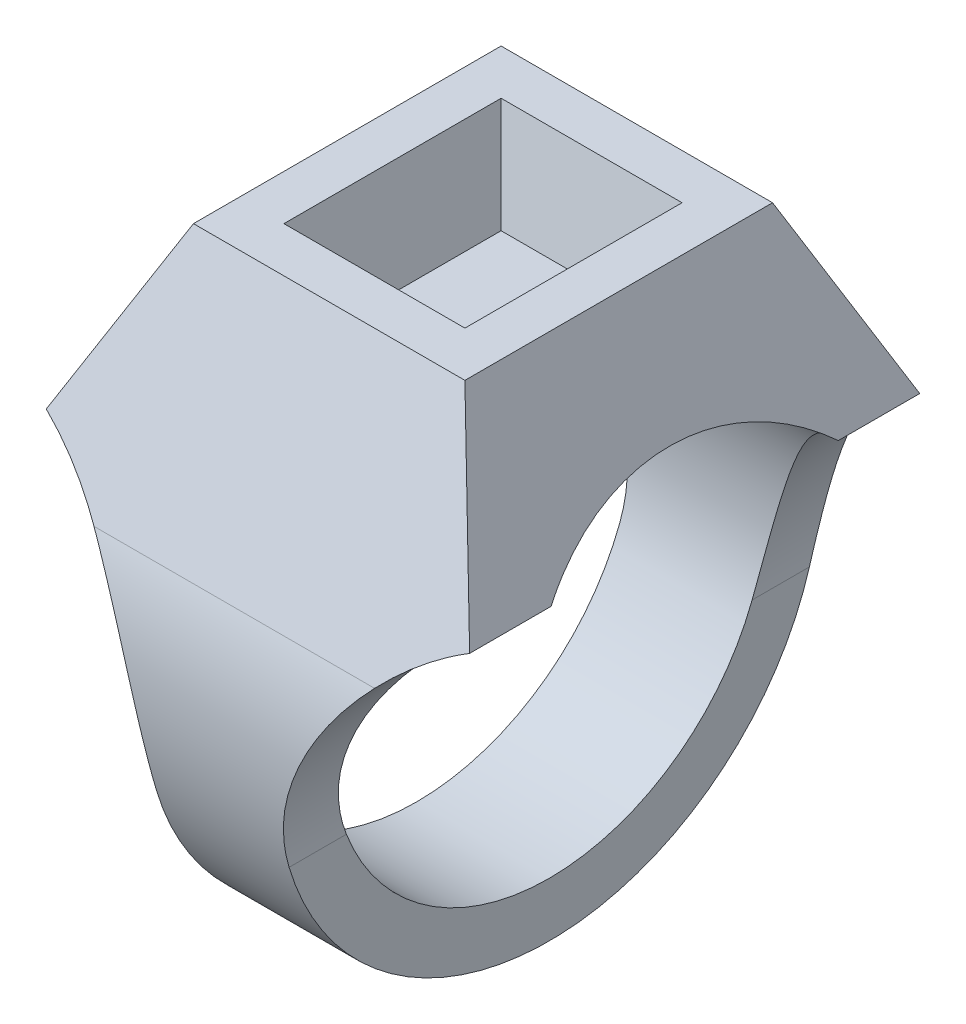
ISO-10303-21;
HEADER;
FILE_DESCRIPTION(('STEP AP214'),'2;1');
FILE_NAME('part.step','',(''),(''),'','','');
FILE_SCHEMA(('AUTOMOTIVE_DESIGN { 1 0 10303 214 1 1 1 1 }'));
ENDSEC;
DATA;
#1=APPLICATION_CONTEXT('core data for automotive mechanical design processes');
#2=APPLICATION_PROTOCOL_DEFINITION('international standard','automotive_design',2000,#1);
#3=PRODUCT_CONTEXT('',#1,'mechanical');
#4=PRODUCT('Part','Part','',(#3));
#5=PRODUCT_RELATED_PRODUCT_CATEGORY('part','',(#4));
#6=PRODUCT_DEFINITION_FORMATION('','',#4);
#7=PRODUCT_DEFINITION_CONTEXT('part definition',#1,'design');
#8=PRODUCT_DEFINITION('design','',#6,#7);
#9=PRODUCT_DEFINITION_SHAPE('','',#8);
#10=(LENGTH_UNIT() NAMED_UNIT(*) SI_UNIT(.MILLI.,.METRE.));
#11=(NAMED_UNIT(*) PLANE_ANGLE_UNIT() SI_UNIT($,.RADIAN.));
#12=(NAMED_UNIT(*) SI_UNIT($,.STERADIAN.) SOLID_ANGLE_UNIT());
#13=UNCERTAINTY_MEASURE_WITH_UNIT(LENGTH_MEASURE(1.E-05),#10,'distance_accuracy_value','');
#14=(GEOMETRIC_REPRESENTATION_CONTEXT(3) GLOBAL_UNCERTAINTY_ASSIGNED_CONTEXT((#13)) GLOBAL_UNIT_ASSIGNED_CONTEXT((#10,
#11,#12)) REPRESENTATION_CONTEXT('',''));
#15=CARTESIAN_POINT('',(0.,0.,0.));
#16=DIRECTION('',(0.,0.,1.));
#17=DIRECTION('',(1.,0.,0.));
#18=AXIS2_PLACEMENT_3D('',#15,#16,#17);
#19=CARTESIAN_POINT('',(25.,0.,0.));
#20=DIRECTION('',(-1.,0.,0.));
#21=DIRECTION('',(0.,0.,1.));
#22=AXIS2_PLACEMENT_3D('',#19,#20,#21);
#23=CYLINDRICAL_SURFACE('',#22,15.);
#24=DIRECTION('',(-1.,0.,0.));
#25=VECTOR('',#24,1.);
#26=CARTESIAN_POINT('',(25.,6.01010177448945,-13.7433138893165));
#27=LINE('',#26,#25);
#28=CARTESIAN_POINT('',(7.7517057095671,6.01010177448945,-13.7433138893165));
#29=VERTEX_POINT('',#28);
#30=CARTESIAN_POINT('',(-7.75170570956712,6.01010177448945,-13.7433138893165));
#31=VERTEX_POINT('',#30);
#32=EDGE_CURVE('E186',#29,#31,#27,.T.);
#33=ORIENTED_EDGE('',*,*,#32,.F.);
#34=CARTESIAN_POINT('',(3.66025403784439,-4.28570190320558,-14.3747264042437));
#35=CARTESIAN_POINT('',(3.66025259433985,-4.13304075132534,-14.4202427174245));
#36=CARTESIAN_POINT('',(3.66258531855331,-3.97967101944831,-14.4633180260757));
#37=CARTESIAN_POINT('',(3.67203147354042,-3.67177413101513,-14.5445324132351));
#38=CARTESIAN_POINT('',(3.67914497988265,-3.51724695620176,-14.582671413705));
#39=CARTESIAN_POINT('',(3.70781868721956,-3.05243054065532,-14.6895765681168));
#40=CARTESIAN_POINT('',(3.73671192533608,-2.74080323264454,-14.7508616047723));
#41=CARTESIAN_POINT('',(3.8142169831451,-2.11951407396792,-14.8528091548694));
#42=CARTESIAN_POINT('',(3.86265418943127,-1.80985886101905,-14.8936472914727));
#43=CARTESIAN_POINT('',(3.97932112119026,-1.19233440681404,-14.9557553087527));
#44=CARTESIAN_POINT('',(4.04754959354892,-0.884465053741912,-14.9770264279893));
#45=CARTESIAN_POINT('',(4.2035509376418,-0.272793820957355,-15.0006444614461));
#46=CARTESIAN_POINT('',(4.29133609936223,0.0310053731159877,-15.0029794409869));
#47=CARTESIAN_POINT('',(4.48580422917582,0.632099884495125,-14.989691187418));
#48=CARTESIAN_POINT('',(4.59248892101565,0.929394605774228,-14.9740663155517));
#49=CARTESIAN_POINT('',(4.82427186709827,1.51650110240405,-14.926060696158));
#50=CARTESIAN_POINT('',(4.94943285004965,1.80628326836027,-14.8936218825108));
#51=CARTESIAN_POINT('',(5.21683163943638,2.37562838670987,-14.8134751636312));
#52=CARTESIAN_POINT('',(5.3590687866077,2.6551917330807,-14.7657678477555));
#53=CARTESIAN_POINT('',(5.66544911924776,3.21366257332854,-14.654576670675));
#54=CARTESIAN_POINT('',(5.8302364796466,3.49210623833861,-14.5905431568425));
#55=CARTESIAN_POINT('',(6.1758384286431,4.03554189712426,-14.4496791832475));
#56=CARTESIAN_POINT('',(6.3566569390949,4.30053057420266,-14.3728455880146));
#57=CARTESIAN_POINT('',(6.73212907252219,4.81488693665887,-14.2087772772515));
#58=CARTESIAN_POINT('',(6.92670728140234,5.06432752187484,-14.1215977142512));
#59=CARTESIAN_POINT('',(7.32933533385921,5.54838796520755,-13.9385211366357));
#60=CARTESIAN_POINT('',(7.53737492096085,5.78301884400246,-13.8426307369831));
#61=CARTESIAN_POINT('',(7.75170570956709,6.01010177448945,-13.7433138893165));
#62=B_SPLINE_CURVE_WITH_KNOTS('',3,(#34,#35,#36,#37,#38,#39,#40,#41,#42,#43,#44,#45,#46,#47,#48,
#49,#50,#51,#52,#53,#54,#55,#56,#57,#58,#59,#60,#61),.UNSPECIFIED.,.F.,.F.,(4,2,2,2,2,2,2,2,2,2,
2,2,2,4),(0.,0.477830385429634,0.955668323979193,1.91102236501524,2.85802349780349,
3.80496468285503,4.752502640111,5.70012706285419,6.65104608184521,7.60192840025113,
8.59044300524671,9.57920011089246,10.5629049754368,11.5458689668184),.UNSPECIFIED.);
#63=CARTESIAN_POINT('',(3.66025403784438,-4.28570190320558,-14.3747264042437));
#64=VERTEX_POINT('',#63);
#65=EDGE_CURVE('E340',#64,#29,#62,.T.);
#66=ORIENTED_EDGE('',*,*,#65,.F.);
#67=CARTESIAN_POINT('',(3.66025403784438,0.,0.));
#68=DIRECTION('',(1.,0.,0.));
#69=DIRECTION('',(0.,0.,-1.));
#70=AXIS2_PLACEMENT_3D('',#67,#68,#69);
#71=CIRCLE('',#70,15.);
#72=CARTESIAN_POINT('',(3.66025403784438,-4.28570190320558,14.3747264042437));
#73=VERTEX_POINT('',#72);
#74=EDGE_CURVE('E257',#73,#64,#71,.T.);
#75=ORIENTED_EDGE('',*,*,#74,.F.);
#76=CARTESIAN_POINT('',(7.7517057095671,6.01010177448945,13.7433138893165));
#77=CARTESIAN_POINT('',(7.51911128471762,5.7636711520732,13.8510963797746));
#78=CARTESIAN_POINT('',(7.29391640303508,5.5083366259365,13.9548444214635));
#79=CARTESIAN_POINT('',(6.85944302357186,4.98024969200351,14.1519084494936));
#80=CARTESIAN_POINT('',(6.65017976067744,4.70748105979186,14.2452144895763));
#81=CARTESIAN_POINT('',(6.24775614222464,4.14345635761959,14.4194137310677));
#82=CARTESIAN_POINT('',(6.05471606173085,3.85208633031462,14.5002174174052));
#83=CARTESIAN_POINT('',(5.68797418374435,3.25373012276761,14.646092341388));
#84=CARTESIAN_POINT('',(5.51426690160751,2.94674840769593,14.7111680471732));
#85=CARTESIAN_POINT('',(5.18660475058305,2.31640461069123,14.8235441586994));
#86=CARTESIAN_POINT('',(5.03279784686604,1.99294226315254,14.8707159493444));
#87=CARTESIAN_POINT('',(4.74799896222376,1.33373374801866,14.9442673092551));
#88=CARTESIAN_POINT('',(4.61700991846731,0.997986005739373,14.970644203291));
#89=CARTESIAN_POINT('',(4.37985682966321,0.318549541972394,15.0004541517164));
#90=CARTESIAN_POINT('',(4.27358133607797,-0.0250955347870552,15.0039922139221));
#91=CARTESIAN_POINT('',(4.08616559230822,-0.718517149885205,14.9867903743605));
#92=CARTESIAN_POINT('',(4.00501617612679,-1.06829140298313,14.9660593391896));
#93=CARTESIAN_POINT('',(3.8901251273768,-1.65839740660689,14.9099798129389));
#94=CARTESIAN_POINT('',(3.84951711829332,-1.89807773497579,14.881396600541));
#95=CARTESIAN_POINT('',(3.78016470772015,-2.37741678200149,14.8123762592006));
#96=CARTESIAN_POINT('',(3.75141784631859,-2.61707549482283,14.7719415911382));
#97=CARTESIAN_POINT('',(3.70553500882263,-3.09634465757099,14.6789808243671));
#98=CARTESIAN_POINT('',(3.68845512806088,-3.33594941308522,14.6263979130722));
#99=CARTESIAN_POINT('',(3.66580177649503,-3.81285436934496,14.5093980183958));
#100=CARTESIAN_POINT('',(3.66023058159539,-4.05015410502751,14.444978697043));
#101=CARTESIAN_POINT('',(3.66025403784439,-4.28570190320558,14.3747264042437));
#102=B_SPLINE_CURVE_WITH_KNOTS('',3,(#76,#77,#78,#79,#80,#81,#82,#83,#84,#85,#86,#87,#88,#89,
#90,#91,#92,#93,#94,#95,#96,#97,#98,#99,#100,#101),.UNSPECIFIED.,.F.,.F.,(4,2,2,2,2,2,2,2,2,2,2,
2,4),(0.,1.06672561935056,2.13445882435115,3.20951449988751,4.28426440442069,5.36659502173,
6.44906485640795,7.52655417167012,8.60364995428889,9.33743465052707,10.0710670888119,
10.8082024929153,11.545483655556),.UNSPECIFIED.);
#103=CARTESIAN_POINT('',(7.7517057095671,6.01010177448945,13.7433138893165));
#104=VERTEX_POINT('',#103);
#105=EDGE_CURVE('E263',#104,#73,#102,.T.);
#106=ORIENTED_EDGE('',*,*,#105,.F.);
#107=DIRECTION('',(-1.,0.,0.));
#108=VECTOR('',#107,1.);
#109=CARTESIAN_POINT('',(25.,6.01010177448945,13.7433138893165));
#110=LINE('',#109,#108);
#111=CARTESIAN_POINT('',(-7.75170570956711,6.01010177448945,13.7433138893165));
#112=VERTEX_POINT('',#111);
#113=EDGE_CURVE('E193',#104,#112,#110,.T.);
#114=ORIENTED_EDGE('',*,*,#113,.T.);
#115=CARTESIAN_POINT('',(-3.66025403784438,-4.28570190320561,14.3747264042437));
#116=CARTESIAN_POINT('',(-3.66025259433984,-4.13304075132537,14.4202427174245));
#117=CARTESIAN_POINT('',(-3.66258531855331,-3.97967101944834,14.4633180260757));
#118=CARTESIAN_POINT('',(-3.67203147354041,-3.67177413101516,14.5445324132351));
#119=CARTESIAN_POINT('',(-3.67914497988265,-3.51724695620179,14.5826714137049));
#120=CARTESIAN_POINT('',(-3.70781868721956,-3.05243054065534,14.6895765681168));
#121=CARTESIAN_POINT('',(-3.73671192533607,-2.74080323264457,14.7508616047723));
#122=CARTESIAN_POINT('',(-3.81421698314509,-2.11951407396795,14.8528091548694));
#123=CARTESIAN_POINT('',(-3.86265418943126,-1.80985886101908,14.8936472914727));
#124=CARTESIAN_POINT('',(-3.97932112119026,-1.19233440681407,14.9557553087527));
#125=CARTESIAN_POINT('',(-4.04754959354892,-0.884465053741942,14.9770264279893));
#126=CARTESIAN_POINT('',(-4.20355093764179,-0.272793820957385,15.0006444614461));
#127=CARTESIAN_POINT('',(-4.29133609936222,0.0310053731159573,15.0029794409869));
#128=CARTESIAN_POINT('',(-4.48580422917582,0.632099884495095,14.989691187418));
#129=CARTESIAN_POINT('',(-4.59248892101564,0.929394605774197,14.9740663155517));
#130=CARTESIAN_POINT('',(-4.82427186709826,1.51650110240402,14.926060696158));
#131=CARTESIAN_POINT('',(-4.94943285004964,1.80628326836024,14.8936218825108));
#132=CARTESIAN_POINT('',(-5.21683163943637,2.37562838670984,14.8134751636312));
#133=CARTESIAN_POINT('',(-5.3590687866077,2.65519173308067,14.7657678477555));
#134=CARTESIAN_POINT('',(-5.66544911924775,3.21366257332851,14.654576670675));
#135=CARTESIAN_POINT('',(-5.8302364796466,3.49210623833859,14.5905431568425));
#136=CARTESIAN_POINT('',(-6.17583842864311,4.03554189712424,14.4496791832475));
#137=CARTESIAN_POINT('',(-6.3566569390949,4.30053057420265,14.3728455880146));
#138=CARTESIAN_POINT('',(-6.7321290725222,4.81488693665886,14.2087772772515));
#139=CARTESIAN_POINT('',(-6.92670728140236,5.06432752187484,14.1215977142512));
#140=CARTESIAN_POINT('',(-7.32933533385923,5.54838796520755,13.9385211366357));
#141=CARTESIAN_POINT('',(-7.53737492096087,5.78301884400246,13.8426307369831));
#142=CARTESIAN_POINT('',(-7.75170570956711,6.01010177448945,13.7433138893165));
#143=B_SPLINE_CURVE_WITH_KNOTS('',3,(#115,#116,#117,#118,#119,#120,#121,#122,#123,#124,#125,
#126,#127,#128,#129,#130,#131,#132,#133,#134,#135,#136,#137,#138,#139,#140,#141,#142),
.UNSPECIFIED.,.F.,.F.,(4,2,2,2,2,2,2,2,2,2,2,2,2,4),(0.,0.477830385429635,0.955668323979194,
1.91102236501524,2.85802349780349,3.80496468285503,4.752502640111,5.70012706285419,
6.6510460818452,7.60192840025113,8.59044300524672,9.57920011089249,10.5629049754368,
11.5458689668185),.UNSPECIFIED.);
#144=CARTESIAN_POINT('',(-3.66025403784438,-4.28570190320561,14.3747264042437));
#145=VERTEX_POINT('',#144);
#146=EDGE_CURVE('E64',#145,#112,#143,.T.);
#147=ORIENTED_EDGE('',*,*,#146,.F.);
#148=CARTESIAN_POINT('',(-3.66025403784438,0.,0.));
#149=DIRECTION('',(-1.,0.,0.));
#150=DIRECTION('',(0.,0.,1.));
#151=AXIS2_PLACEMENT_3D('',#148,#149,#150);
#152=CIRCLE('',#151,15.);
#153=CARTESIAN_POINT('',(-3.66025403784438,-4.28570190320561,-14.3747264042437));
#154=VERTEX_POINT('',#153);
#155=EDGE_CURVE('E254',#154,#145,#152,.T.);
#156=ORIENTED_EDGE('',*,*,#155,.F.);
#157=CARTESIAN_POINT('',(-7.75170570956711,6.01010177448945,-13.7433138893165));
#158=CARTESIAN_POINT('',(-7.51911128471763,5.76367115207319,-13.8510963797746));
#159=CARTESIAN_POINT('',(-7.29391640303509,5.5083366259365,-13.9548444214635));
#160=CARTESIAN_POINT('',(-6.85944302357187,4.9802496920035,-14.1519084494936));
#161=CARTESIAN_POINT('',(-6.65017976067745,4.70748105979186,-14.2452144895763));
#162=CARTESIAN_POINT('',(-6.24775614222465,4.14345635761959,-14.4194137310677));
#163=CARTESIAN_POINT('',(-6.05471606173086,3.85208633031462,-14.5002174174052));
#164=CARTESIAN_POINT('',(-5.68797418374435,3.2537301227676,-14.646092341388));
#165=CARTESIAN_POINT('',(-5.51426690160752,2.94674840769592,-14.7111680471732));
#166=CARTESIAN_POINT('',(-5.18660475058306,2.31640461069123,-14.8235441586994));
#167=CARTESIAN_POINT('',(-5.03279784686605,1.99294226315254,-14.8707159493444));
#168=CARTESIAN_POINT('',(-4.74799896222376,1.33373374801866,-14.9442673092551));
#169=CARTESIAN_POINT('',(-4.61700991846732,0.997986005739371,-14.970644203291));
#170=CARTESIAN_POINT('',(-4.37985682966321,0.318549541972392,-15.0004541517164));
#171=CARTESIAN_POINT('',(-4.27358133607797,-0.0250955347870578,-15.0039922139221));
#172=CARTESIAN_POINT('',(-4.08616559230822,-0.718517149885207,-14.9867903743605));
#173=CARTESIAN_POINT('',(-4.00501617612679,-1.06829140298313,-14.9660593391896));
#174=CARTESIAN_POINT('',(-3.8901251273768,-1.65839740660689,-14.9099798129389));
#175=CARTESIAN_POINT('',(-3.84951711829332,-1.8980777349758,-14.881396600541));
#176=CARTESIAN_POINT('',(-3.78016470772014,-2.37741678200151,-14.8123762592006));
#177=CARTESIAN_POINT('',(-3.75141784631859,-2.61707549482284,-14.7719415911382));
#178=CARTESIAN_POINT('',(-3.70553500882263,-3.096344657571,-14.6789808243671));
#179=CARTESIAN_POINT('',(-3.68845512806088,-3.33594941308524,-14.6263979130722));
#180=CARTESIAN_POINT('',(-3.66580177649502,-3.81285436934498,-14.5093980183958));
#181=CARTESIAN_POINT('',(-3.66023058159538,-4.05015410502754,-14.444978697043));
#182=CARTESIAN_POINT('',(-3.66025403784438,-4.28570190320561,-14.3747264042437));
#183=B_SPLINE_CURVE_WITH_KNOTS('',3,(#157,#158,#159,#160,#161,#162,#163,#164,#165,#166,#167,
#168,#169,#170,#171,#172,#173,#174,#175,#176,#177,#178,#179,#180,#181,#182),.UNSPECIFIED.,.F.,
.F.,(4,2,2,2,2,2,2,2,2,2,2,2,4),(0.,1.06672561935056,2.13445882435115,3.20951449988751,
4.28426440442069,5.36659502173,6.44906485640796,7.52655417167013,8.6036499542889,
9.33743465052709,10.0710670888119,10.8082024929153,11.5454836555561),.UNSPECIFIED.);
#184=EDGE_CURVE('E247',#31,#154,#183,.T.);
#185=ORIENTED_EDGE('',*,*,#184,.F.);
#186=EDGE_LOOP('',(#33,#66,#75,#106,#114,#147,#156,#185));
#187=FACE_BOUND('',#186,.T.);
#188=ADVANCED_FACE('F40',(#187),#23,.T.);
#189=CARTESIAN_POINT('',(25.,18.,8.5));
#190=DIRECTION('',(0.,-1.,0.));
#191=DIRECTION('',(0.,0.,-1.));
#192=AXIS2_PLACEMENT_3D('',#189,#190,#191);
#193=PLANE('',#192);
#194=DIRECTION('',(-1.,0.,0.));
#195=VECTOR('',#194,1.);
#196=CARTESIAN_POINT('',(-5.,18.,-6.));
#197=LINE('',#196,#195);
#198=CARTESIAN_POINT('',(5.,18.,-5.99999999999999));
#199=VERTEX_POINT('',#198);
#200=CARTESIAN_POINT('',(-5.,18.,-6.));
#201=VERTEX_POINT('',#200);
#202=EDGE_CURVE('E369',#199,#201,#197,.T.);
#203=ORIENTED_EDGE('',*,*,#202,.F.);
#204=DIRECTION('',(0.,0.,-1.));
#205=VECTOR('',#204,1.);
#206=CARTESIAN_POINT('',(5.,18.,-6.));
#207=LINE('',#206,#205);
#208=CARTESIAN_POINT('',(5.,18.,6.));
#209=VERTEX_POINT('',#208);
#210=EDGE_CURVE('E366',#209,#199,#207,.T.);
#211=ORIENTED_EDGE('',*,*,#210,.F.);
#212=DIRECTION('',(1.,0.,0.));
#213=VECTOR('',#212,1.);
#214=CARTESIAN_POINT('',(-5.,18.,6.));
#215=LINE('',#214,#213);
#216=CARTESIAN_POINT('',(-5.,18.,6.));
#217=VERTEX_POINT('',#216);
#218=EDGE_CURVE('E377',#217,#209,#215,.T.);
#219=ORIENTED_EDGE('',*,*,#218,.F.);
#220=DIRECTION('',(0.,0.,1.));
#221=VECTOR('',#220,1.);
#222=CARTESIAN_POINT('',(-5.,18.,-6.));
#223=LINE('',#222,#221);
#224=EDGE_CURVE('E373',#201,#217,#223,.T.);
#225=ORIENTED_EDGE('',*,*,#224,.F.);
#226=EDGE_LOOP('',(#203,#211,#219,#225));
#227=FACE_BOUND('',#226,.T.);
#228=DIRECTION('',(0.,0.,1.));
#229=VECTOR('',#228,1.);
#230=CARTESIAN_POINT('',(-7.5,18.,-15.));
#231=LINE('',#230,#229);
#232=CARTESIAN_POINT('',(-7.5,18.,-8.5));
#233=VERTEX_POINT('',#232);
#234=CARTESIAN_POINT('',(-7.5,18.,8.5));
#235=VERTEX_POINT('',#234);
#236=EDGE_CURVE('E179',#233,#235,#231,.T.);
#237=ORIENTED_EDGE('',*,*,#236,.T.);
#238=DIRECTION('',(-1.,0.,0.));
#239=VECTOR('',#238,1.);
#240=CARTESIAN_POINT('',(25.,18.,8.5));
#241=LINE('',#240,#239);
#242=CARTESIAN_POINT('',(7.49999999999999,18.,8.49999999999999));
#243=VERTEX_POINT('',#242);
#244=EDGE_CURVE('E177',#243,#235,#241,.T.);
#245=ORIENTED_EDGE('',*,*,#244,.F.);
#246=DIRECTION('',(0.,0.,1.));
#247=VECTOR('',#246,1.);
#248=CARTESIAN_POINT('',(7.5,18.,-15.));
#249=LINE('',#248,#247);
#250=CARTESIAN_POINT('',(7.5,18.,-8.5));
#251=VERTEX_POINT('',#250);
#252=EDGE_CURVE('E159',#251,#243,#249,.T.);
#253=ORIENTED_EDGE('',*,*,#252,.F.);
#254=DIRECTION('',(-1.,0.,0.));
#255=VECTOR('',#254,1.);
#256=CARTESIAN_POINT('',(25.,18.,-8.5));
#257=LINE('',#256,#255);
#258=EDGE_CURVE('E175',#251,#233,#257,.T.);
#259=ORIENTED_EDGE('',*,*,#258,.T.);
#260=EDGE_LOOP('',(#237,#245,#253,#259));
#261=FACE_BOUND('',#260,.T.);
#262=ADVANCED_FACE('F174',(#227,#261),#193,.F.);
#263=CARTESIAN_POINT('',(25.,6.01010177448945,-13.7433138893165));
#264=DIRECTION('',(0.,-0.40067345163263,0.916220925954431));
#265=DIRECTION('',(0.,-0.916220925954431,-0.40067345163263));
#266=AXIS2_PLACEMENT_3D('',#263,#264,#265);
#267=PLANE('',#266);
#268=DIRECTION('',(-0.39288532027906,0.842545288305063,0.368454287889501));
#269=VECTOR('',#268,1.);
#270=CARTESIAN_POINT('',(14.9292440809068,2.06793465434063,-15.4672667725114));
#271=LINE('',#270,#269);
#272=CARTESIAN_POINT('',(11.696768923395,9.00000000000001,-12.4357986295033));
#273=VERTEX_POINT('',#272);
#274=EDGE_CURVE('E156',#273,#251,#271,.T.);
#275=ORIENTED_EDGE('',*,*,#274,.F.);
#276=CARTESIAN_POINT('',(18.6602540378444,-4.28570190320559,-18.2457816675728));
#277=DIRECTION('',(0.,-0.40067345163263,0.916220925954431));
#278=DIRECTION('',(0.,0.916220925954431,0.40067345163263));
#279=AXIS2_PLACEMENT_3D('',#276,#277,#278);
#280=ELLIPSE('',#279,16.3715972590065,15.);
#281=EDGE_CURVE('E271',#29,#273,#280,.F.);
#282=ORIENTED_EDGE('',*,*,#281,.F.);
#283=ORIENTED_EDGE('',*,*,#32,.T.);
#284=CARTESIAN_POINT('',(-18.6602540378444,-4.28570190320561,-18.2457816675728));
#285=DIRECTION('',(0.,-0.40067345163263,0.916220925954431));
#286=DIRECTION('',(0.,0.916220925954431,0.40067345163263));
#287=AXIS2_PLACEMENT_3D('',#284,#285,#286);
#288=ELLIPSE('',#287,16.3715972590065,15.);
#289=CARTESIAN_POINT('',(-11.696768923395,9.,-12.4357986295033));
#290=VERTEX_POINT('',#289);
#291=EDGE_CURVE('E242',#290,#31,#288,.F.);
#292=ORIENTED_EDGE('',*,*,#291,.F.);
#293=DIRECTION('',(-0.392885320279059,-0.842545288305063,-0.368454287889501));
#294=VECTOR('',#293,1.);
#295=CARTESIAN_POINT('',(-7.21130033636783,18.619118426608,-8.22925272722845));
#296=LINE('',#295,#294);
#297=EDGE_CURVE('E184',#233,#290,#296,.T.);
#298=ORIENTED_EDGE('',*,*,#297,.F.);
#299=ORIENTED_EDGE('',*,*,#258,.F.);
#300=EDGE_LOOP('',(#275,#282,#283,#292,#298,#299));
#301=FACE_BOUND('',#300,.T.);
#302=ADVANCED_FACE('F182',(#301),#267,.F.);
#303=CARTESIAN_POINT('',(25.,6.01010177448945,13.7433138893165));
#304=DIRECTION('',(0.,-0.40067345163263,-0.916220925954431));
#305=DIRECTION('',(0.,0.916220925954431,-0.40067345163263));
#306=AXIS2_PLACEMENT_3D('',#303,#304,#305);
#307=PLANE('',#306);
#308=DIRECTION('',(0.39288532027906,-0.842545288305063,0.368454287889501));
#309=VECTOR('',#308,1.);
#310=CARTESIAN_POINT('',(14.9292440809068,2.06793465434063,15.4672667725114));
#311=LINE('',#310,#309);
#312=CARTESIAN_POINT('',(11.696768923395,9.00000000000001,12.4357986295033));
#313=VERTEX_POINT('',#312);
#314=EDGE_CURVE('E168',#243,#313,#311,.T.);
#315=ORIENTED_EDGE('',*,*,#314,.F.);
#316=ORIENTED_EDGE('',*,*,#244,.T.);
#317=DIRECTION('',(0.392885320279059,0.842545288305063,-0.368454287889501));
#318=VECTOR('',#317,1.);
#319=CARTESIAN_POINT('',(-7.21130033636783,18.619118426608,8.22925272722845));
#320=LINE('',#319,#318);
#321=CARTESIAN_POINT('',(-11.696768923395,9.,12.4357986295033));
#322=VERTEX_POINT('',#321);
#323=EDGE_CURVE('E167',#322,#235,#320,.T.);
#324=ORIENTED_EDGE('',*,*,#323,.F.);
#325=CARTESIAN_POINT('',(-18.6602540378444,-4.28570190320561,18.2457816675728));
#326=DIRECTION('',(0.,-0.40067345163263,-0.916220925954431));
#327=DIRECTION('',(0.,-0.916220925954431,0.40067345163263));
#328=AXIS2_PLACEMENT_3D('',#325,#326,#327);
#329=ELLIPSE('',#328,16.3715972590065,15.);
#330=EDGE_CURVE('E243',#112,#322,#329,.F.);
#331=ORIENTED_EDGE('',*,*,#330,.F.);
#332=ORIENTED_EDGE('',*,*,#113,.F.);
#333=CARTESIAN_POINT('',(18.6602540378444,-4.28570190320559,18.2457816675728));
#334=DIRECTION('',(0.,-0.40067345163263,-0.916220925954431));
#335=DIRECTION('',(0.,-0.916220925954431,0.40067345163263));
#336=AXIS2_PLACEMENT_3D('',#333,#334,#335);
#337=ELLIPSE('',#336,16.3715972590065,15.);
#338=EDGE_CURVE('E260',#313,#104,#337,.F.);
#339=ORIENTED_EDGE('',*,*,#338,.F.);
#340=EDGE_LOOP('',(#315,#316,#324,#331,#332,#339));
#341=FACE_BOUND('',#340,.T.);
#342=ADVANCED_FACE('F411',(#341),#307,.F.);
#343=CARTESIAN_POINT('',(5.,18.,-6.));
#344=DIRECTION('',(0.965925826289068,-0.258819045102521,0.));
#345=DIRECTION('',(0.258819045102521,0.965925826289068,0.));
#346=AXIS2_PLACEMENT_3D('',#343,#344,#345);
#347=PLANE('',#346);
#348=ORIENTED_EDGE('',*,*,#210,.T.);
#349=DIRECTION('',(0.250562807085732,0.935113126531029,-0.250562807085732));
#350=VECTOR('',#349,1.);
#351=CARTESIAN_POINT('',(5.,18.,-6.));
#352=LINE('',#351,#350);
#353=CARTESIAN_POINT('',(3.66025403784438,13.,-4.66025403784438));
#354=VERTEX_POINT('',#353);
#355=EDGE_CURVE('E386',#354,#199,#352,.T.);
#356=ORIENTED_EDGE('',*,*,#355,.F.);
#357=DIRECTION('',(0.,0.,-1.));
#358=VECTOR('',#357,1.);
#359=CARTESIAN_POINT('',(3.66025403784438,13.,0.));
#360=LINE('',#359,#358);
#361=CARTESIAN_POINT('',(3.66025403784438,13.,4.66025403784439));
#362=VERTEX_POINT('',#361);
#363=EDGE_CURVE('E381',#362,#354,#360,.T.);
#364=ORIENTED_EDGE('',*,*,#363,.F.);
#365=DIRECTION('',(0.250562807085732,0.935113126531029,0.250562807085732));
#366=VECTOR('',#365,1.);
#367=CARTESIAN_POINT('',(4.37218279705318,15.6569543007367,5.37218279705319));
#368=LINE('',#367,#366);
#369=EDGE_CURVE('E382',#362,#209,#368,.T.);
#370=ORIENTED_EDGE('',*,*,#369,.T.);
#371=EDGE_LOOP('',(#348,#356,#364,#370));
#372=FACE_BOUND('',#371,.T.);
#373=ADVANCED_FACE('F427',(#372),#347,.F.);
#374=CARTESIAN_POINT('',(-5.,18.,6.));
#375=DIRECTION('',(0.,-0.258819045102522,0.965925826289068));
#376=DIRECTION('',(0.,-0.965925826289068,-0.258819045102522));
#377=AXIS2_PLACEMENT_3D('',#374,#375,#376);
#378=PLANE('',#377);
#379=ORIENTED_EDGE('',*,*,#218,.T.);
#380=ORIENTED_EDGE('',*,*,#369,.F.);
#381=DIRECTION('',(1.,0.,0.));
#382=VECTOR('',#381,1.);
#383=CARTESIAN_POINT('',(0.,13.,4.66025403784439));
#384=LINE('',#383,#382);
#385=CARTESIAN_POINT('',(-3.66025403784438,13.,4.66025403784439));
#386=VERTEX_POINT('',#385);
#387=EDGE_CURVE('E391',#386,#362,#384,.T.);
#388=ORIENTED_EDGE('',*,*,#387,.F.);
#389=DIRECTION('',(-0.250562807085732,0.935113126531029,0.250562807085732));
#390=VECTOR('',#389,1.);
#391=CARTESIAN_POINT('',(-4.24661935646382,15.188345160884,5.24661935646382));
#392=LINE('',#391,#390);
#393=EDGE_CURVE('E385',#386,#217,#392,.T.);
#394=ORIENTED_EDGE('',*,*,#393,.T.);
#395=EDGE_LOOP('',(#379,#380,#388,#394));
#396=FACE_BOUND('',#395,.T.);
#397=ADVANCED_FACE('F431',(#396),#378,.F.);
#398=CARTESIAN_POINT('',(-5.,18.,-6.));
#399=DIRECTION('',(-0.965925826289068,-0.258819045102521,0.));
#400=DIRECTION('',(0.258819045102521,-0.965925826289068,0.));
#401=AXIS2_PLACEMENT_3D('',#398,#399,#400);
#402=PLANE('',#401);
#403=ORIENTED_EDGE('',*,*,#224,.T.);
#404=ORIENTED_EDGE('',*,*,#393,.F.);
#405=DIRECTION('',(0.,0.,1.));
#406=VECTOR('',#405,1.);
#407=CARTESIAN_POINT('',(-3.66025403784438,13.,0.));
#408=LINE('',#407,#406);
#409=CARTESIAN_POINT('',(-3.66025403784438,13.,-4.66025403784438));
#410=VERTEX_POINT('',#409);
#411=EDGE_CURVE('E403',#410,#386,#408,.T.);
#412=ORIENTED_EDGE('',*,*,#411,.F.);
#413=DIRECTION('',(-0.250562807085732,0.935113126531029,-0.250562807085732));
#414=VECTOR('',#413,1.);
#415=CARTESIAN_POINT('',(-5.,18.,-6.));
#416=LINE('',#415,#414);
#417=EDGE_CURVE('E390',#410,#201,#416,.T.);
#418=ORIENTED_EDGE('',*,*,#417,.T.);
#419=EDGE_LOOP('',(#403,#404,#412,#418));
#420=FACE_BOUND('',#419,.T.);
#421=ADVANCED_FACE('F437',(#420),#402,.F.);
#422=CARTESIAN_POINT('',(-5.,18.,-6.));
#423=DIRECTION('',(0.,-0.258819045102521,-0.965925826289068));
#424=DIRECTION('',(0.,0.965925826289068,-0.258819045102521));
#425=AXIS2_PLACEMENT_3D('',#422,#423,#424);
#426=PLANE('',#425);
#427=ORIENTED_EDGE('',*,*,#202,.T.);
#428=ORIENTED_EDGE('',*,*,#417,.F.);
#429=DIRECTION('',(-1.,0.,0.));
#430=VECTOR('',#429,1.);
#431=CARTESIAN_POINT('',(0.,13.,-4.66025403784438));
#432=LINE('',#431,#430);
#433=EDGE_CURVE('E399',#354,#410,#432,.T.);
#434=ORIENTED_EDGE('',*,*,#433,.F.);
#435=ORIENTED_EDGE('',*,*,#355,.T.);
#436=EDGE_LOOP('',(#427,#428,#434,#435));
#437=FACE_BOUND('',#436,.T.);
#438=ADVANCED_FACE('F441',(#437),#426,.F.);
#439=CARTESIAN_POINT('',(0.,13.,0.));
#440=DIRECTION('',(0.,1.,0.));
#441=DIRECTION('',(0.,0.,1.));
#442=AXIS2_PLACEMENT_3D('',#439,#440,#441);
#443=PLANE('',#442);
#444=ORIENTED_EDGE('',*,*,#363,.T.);
#445=ORIENTED_EDGE('',*,*,#433,.T.);
#446=ORIENTED_EDGE('',*,*,#411,.T.);
#447=ORIENTED_EDGE('',*,*,#387,.T.);
#448=EDGE_LOOP('',(#444,#445,#446,#447));
#449=FACE_BOUND('',#448,.T.);
#450=ADVANCED_FACE('F440',(#449),#443,.T.);
#451=CARTESIAN_POINT('',(-18.6602540378444,-4.28570190320561,-15.));
#452=DIRECTION('',(0.,0.,1.));
#453=DIRECTION('',(1.,0.,0.));
#454=AXIS2_PLACEMENT_3D('',#451,#452,#453);
#455=CYLINDRICAL_SURFACE('',#454,15.);
#456=ORIENTED_EDGE('',*,*,#146,.T.);
#457=ORIENTED_EDGE('',*,*,#330,.T.);
#458=DIRECTION('',(0.,0.,1.));
#459=VECTOR('',#458,1.);
#460=CARTESIAN_POINT('',(-11.696768923395,9.,-15.));
#461=LINE('',#460,#459);
#462=CARTESIAN_POINT('',(-11.696768923395,9.,7.93725393319377));
#463=VERTEX_POINT('',#462);
#464=EDGE_CURVE('E330',#463,#322,#461,.T.);
#465=ORIENTED_EDGE('',*,*,#464,.F.);
#466=CARTESIAN_POINT('',(-3.66025403784438,-4.28570190320561,11.208602017953));
#467=CARTESIAN_POINT('',(-3.66025289385626,-4.15666821254097,11.2579402005307));
#468=CARTESIAN_POINT('',(-3.66191954664805,-4.02679569855867,11.3050423805306));
#469=CARTESIAN_POINT('',(-3.66870494472763,-3.7655814077055,11.3947122224123));
#470=CARTESIAN_POINT('',(-3.67382375636108,-3.63423960264461,11.4372797971271));
#471=CARTESIAN_POINT('',(-3.69452993308217,-3.23839072138253,11.5580656961837));
#472=CARTESIAN_POINT('',(-3.71546693324642,-2.97200093979662,11.6293898302861));
#473=CARTESIAN_POINT('',(-3.77211810456376,-2.43764637135599,11.7529906538832));
#474=CARTESIAN_POINT('',(-3.8077681066532,-2.16969334469712,11.8053482244972));
#475=CARTESIAN_POINT('',(-3.89413650805573,-1.63323806203887,11.8914387459));
#476=CARTESIAN_POINT('',(-3.94485376193629,-1.36473584932972,11.9251731118926));
#477=CARTESIAN_POINT('',(-4.06137295522389,-0.829136421683084,11.9743441324535));
#478=CARTESIAN_POINT('',(-4.12718603207409,-0.562040393781821,11.989767225127));
#479=CARTESIAN_POINT('',(-4.2735505383143,-0.0314679456112853,12.0028930661946));
#480=CARTESIAN_POINT('',(-4.35410320564055,0.23200816863201,12.0005943255148));
#481=CARTESIAN_POINT('',(-4.52937981454552,0.753554384708659,11.9791610206477));
#482=CARTESIAN_POINT('',(-4.62410718417683,1.01162316155615,11.9600223783688));
#483=CARTESIAN_POINT('',(-4.82694659938175,1.52073444244027,11.9060029498324));
#484=CARTESIAN_POINT('',(-4.9350588389493,1.7717768445753,11.8711219353931));
#485=CARTESIAN_POINT('',(-5.16657304618528,2.27160525109969,11.7858241673588));
#486=CARTESIAN_POINT('',(-5.29028394670959,2.52018640652915,11.7350487918123));
#487=CARTESIAN_POINT('',(-5.5498482429628,3.00768966072066,11.6196634993291));
#488=CARTESIAN_POINT('',(-5.68570593465561,3.24660829839973,11.5550486764204));
#489=CARTESIAN_POINT('',(-5.968589952589,3.71406927276069,11.4133854836868));
#490=CARTESIAN_POINT('',(-6.11562199623054,3.94260620075182,11.336330725943));
#491=CARTESIAN_POINT('',(-6.41984304308252,4.38870106825986,11.1712084376251));
#492=CARTESIAN_POINT('',(-6.57703425138164,4.60625660584635,11.0831385122573));
#493=CARTESIAN_POINT('',(-6.98984415912581,5.14682101916881,10.8461501463579));
#494=CARTESIAN_POINT('',(-7.2519879669303,5.46191148336536,10.6904350464409));
#495=CARTESIAN_POINT('',(-7.79572388288511,6.06450918048039,10.3604943100577));
#496=CARTESIAN_POINT('',(-8.07732618489595,6.35200176417416,10.1862589451238));
#497=CARTESIAN_POINT('',(-8.65798660595025,6.8997412080764,9.82352137071233));
#498=CARTESIAN_POINT('',(-8.9570645514628,7.15995614841224,9.6350028819147));
#499=CARTESIAN_POINT('',(-9.57067526369639,7.65307634640008,9.2481660351585));
#500=CARTESIAN_POINT('',(-9.88520171207707,7.88599263919584,9.04985168346075));
#501=CARTESIAN_POINT('',(-10.4476839554415,8.26972020344365,8.69834836692443));
#502=CARTESIAN_POINT('',(-10.6924225582769,8.42642340942854,8.54639307267413));
#503=CARTESIAN_POINT('',(-11.1890423427721,8.72445785674035,8.24191451223928));
#504=CARTESIAN_POINT('',(-11.4408908361917,8.8658483919558,8.0893959888896));
#505=CARTESIAN_POINT('',(-11.696768923395,9.,7.93725393319378));
#506=B_SPLINE_CURVE_WITH_KNOTS('',3,(#466,#467,#468,#469,#470,#471,#472,#473,#474,#475,#476,
#477,#478,#479,#480,#481,#482,#483,#484,#485,#486,#487,#488,#489,#490,#491,#492,#493,#494,#495,
#496,#497,#498,#499,#500,#501,#502,#503,#504,#505),.UNSPECIFIED.,.F.,.F.,(4,2,2,2,2,2,2,2,2,2,2,
2,2,2,2,2,2,2,2,4),(0.,0.414371622209197,0.828751208288664,1.65732076285947,2.48231416790148,
3.30724487188891,4.13278616467098,4.95839682416713,5.78420747549851,6.610030097139,
7.45602169653009,8.30231369092748,9.14904164748354,9.99595401112197,11.3093455277277,
12.6234303944427,13.9390362090866,15.2541083584345,16.2375063650245,17.2169489529397),.UNSPECIFIED.);
#507=CARTESIAN_POINT('',(-3.66025403784438,-4.28570190320561,11.208602017953));
#508=VERTEX_POINT('',#507);
#509=EDGE_CURVE('E191',#508,#463,#506,.T.);
#510=ORIENTED_EDGE('',*,*,#509,.F.);
#511=DIRECTION('',(0.,0.,1.));
#512=VECTOR('',#511,1.);
#513=CARTESIAN_POINT('',(-3.66025403784438,-4.28570190320561,-15.));
#514=LINE('',#513,#512);
#515=EDGE_CURVE('E317',#508,#145,#514,.T.);
#516=ORIENTED_EDGE('',*,*,#515,.T.);
#517=EDGE_LOOP('',(#456,#457,#465,#510,#516));
#518=FACE_BOUND('',#517,.T.);
#519=ADVANCED_FACE('F218',(#518),#455,.F.);
#520=ORIENTED_EDGE('',*,*,#184,.T.);
#521=CARTESIAN_POINT('',(-3.66025403784438,-4.28570190320561,-11.208602017953));
#522=VERTEX_POINT('',#521);
#523=EDGE_CURVE('E315',#154,#522,#514,.T.);
#524=ORIENTED_EDGE('',*,*,#523,.T.);
#525=CARTESIAN_POINT('',(-11.696768923395,9.,-7.93725393319377));
#526=CARTESIAN_POINT('',(-11.4986332152758,8.89613646392366,-8.05503623666532));
#527=CARTESIAN_POINT('',(-11.302925199272,8.78792228734898,-8.17306747294295));
#528=CARTESIAN_POINT('',(-10.9163330717224,8.56271576962795,-8.40871044856499));
#529=CARTESIAN_POINT('',(-10.7254494705803,8.44572250484309,-8.52632214240237));
#530=CARTESIAN_POINT('',(-10.3480974160233,8.20263285157219,-8.76044343519151));
#531=CARTESIAN_POINT('',(-10.1616397224852,8.07651680220561,-8.87695000245382));
#532=CARTESIAN_POINT('',(-9.7937067819123,7.81534089928587,-9.10773400365124));
#533=CARTESIAN_POINT('',(-9.61223138655243,7.68028131239487,-9.22201150391721));
#534=CARTESIAN_POINT('',(-9.0710427609973,7.25805014863891,-9.56308992374321));
#535=CARTESIAN_POINT('',(-8.71919951369501,6.95679714246863,-9.78522663471434));
#536=CARTESIAN_POINT('',(-8.03926883740063,6.31676466984975,-10.2100867403394));
#537=CARTESIAN_POINT('',(-7.71115707975593,5.9780245619836,-10.4128300871763));
#538=CARTESIAN_POINT('',(-7.18930117560125,5.38465551756463,-10.727380687125));
#539=CARTESIAN_POINT('',(-6.98786682986298,5.14069424711316,-10.8466346574497));
#540=CARTESIAN_POINT('',(-6.59808887629957,4.63649927214344,-11.0715424312229));
#541=CARTESIAN_POINT('',(-6.40974514358116,4.37626572291873,-11.1771963644332));
#542=CARTESIAN_POINT('',(-6.0485109563904,3.84126816310078,-11.3721304208723));
#543=CARTESIAN_POINT('',(-5.8755547606379,3.56657482830842,-11.4614821041168));
#544=CARTESIAN_POINT('',(-5.54582267033259,3.00253099566036,-11.6219935589719));
#545=CARTESIAN_POINT('',(-5.3890441048824,2.71318292907199,-11.6931563364125));
#546=CARTESIAN_POINT('',(-5.11584766466008,2.1662585150317,-11.80563410561));
#547=CARTESIAN_POINT('',(-4.99691623154367,1.91053067200374,-11.8498407480669));
#548=CARTESIAN_POINT('',(-4.77295067318938,1.39081461663185,-11.9220148650198));
#549=CARTESIAN_POINT('',(-4.66791541339807,1.12682708082951,-11.9499836658874));
#550=CARTESIAN_POINT('',(-4.47264726993299,0.592088723114592,-11.9883815343054));
#551=CARTESIAN_POINT('',(-4.38241786939253,0.321336326956393,-11.9988064799225));
#552=CARTESIAN_POINT('',(-4.21755190717933,-0.224944576860645,-12.0009999491761));
#553=CARTESIAN_POINT('',(-4.14291422795034,-0.50047274067619,-11.9927698104407));
#554=CARTESIAN_POINT('',(-4.00579258117407,-1.07048191681349,-11.9557659450564));
#555=CARTESIAN_POINT('',(-3.9442838013467,-1.3651231286737,-11.9258103790895));
#556=CARTESIAN_POINT('',(-3.83947979575995,-1.95454519116863,-11.8434934024952));
#557=CARTESIAN_POINT('',(-3.79618707304846,-2.24932605542514,-11.7911289146759));
#558=CARTESIAN_POINT('',(-3.72732747331739,-2.83794524255676,-11.6635011931448));
#559=CARTESIAN_POINT('',(-3.70187047196895,-3.13176681302994,-11.5881000583967));
#560=CARTESIAN_POINT('',(-3.67671586521151,-3.56815678530819,-11.4582434801974));
#561=CARTESIAN_POINT('',(-3.67050286073728,-3.71291896775279,-11.4121568457917));
#562=CARTESIAN_POINT('',(-3.66227117315568,-4.00069288312329,-11.3144837377648));
#563=CARTESIAN_POINT('',(-3.6602523743592,-4.14370466422247,-11.2628974158831));
#564=CARTESIAN_POINT('',(-3.66025403784438,-4.28570190320561,-11.208602017953));
#565=B_SPLINE_CURVE_WITH_KNOTS('',3,(#525,#526,#527,#528,#529,#530,#531,#532,#533,#534,#535,
#536,#537,#538,#539,#540,#541,#542,#543,#544,#545,#546,#547,#548,#549,#550,#551,#552,#553,#554,
#555,#556,#557,#558,#559,#560,#561,#562,#563,#564),.UNSPECIFIED.,.F.,.F.,(4,2,2,2,2,2,2,2,2,2,2,
2,2,2,2,2,2,2,2,4),(0.,0.758411760837463,1.51690342554254,2.27708146338456,3.03723684581457,
4.57616366041726,6.1134897802378,7.12700090700409,8.14050236286161,9.14944192117384,
10.1582146379814,11.0137849016296,11.8692852690565,12.7249866084692,13.5806265933509,
14.4866801251447,15.3928581161075,16.3045705982161,16.7605713406663,17.2165595050441),.UNSPECIFIED.);
#566=CARTESIAN_POINT('',(-11.696768923395,9.,-7.93725393319377));
#567=VERTEX_POINT('',#566);
#568=EDGE_CURVE('E228',#567,#522,#565,.T.);
#569=ORIENTED_EDGE('',*,*,#568,.F.);
#570=EDGE_CURVE('E328',#290,#567,#461,.T.);
#571=ORIENTED_EDGE('',*,*,#570,.F.);
#572=ORIENTED_EDGE('',*,*,#291,.T.);
#573=EDGE_LOOP('',(#520,#524,#569,#571,#572));
#574=FACE_BOUND('',#573,.T.);
#575=ADVANCED_FACE('F212',(#574),#455,.F.);
#576=CARTESIAN_POINT('',(-3.66025403784438,-4.28570190320561,-15.));
#577=DIRECTION('',(-1.,0.,0.));
#578=DIRECTION('',(0.,0.,1.));
#579=AXIS2_PLACEMENT_3D('',#576,#577,#578);
#580=PLANE('',#579);
#581=ORIENTED_EDGE('',*,*,#155,.T.);
#582=ORIENTED_EDGE('',*,*,#515,.F.);
#583=CARTESIAN_POINT('',(-3.66025403784438,0.,0.));
#584=DIRECTION('',(-1.,0.,0.));
#585=DIRECTION('',(0.,0.,1.));
#586=AXIS2_PLACEMENT_3D('',#583,#584,#585);
#587=CIRCLE('',#586,12.);
#588=EDGE_CURVE('E206',#522,#508,#587,.T.);
#589=ORIENTED_EDGE('',*,*,#588,.F.);
#590=ORIENTED_EDGE('',*,*,#523,.F.);
#591=EDGE_LOOP('',(#581,#582,#589,#590));
#592=FACE_BOUND('',#591,.T.);
#593=ADVANCED_FACE('F217',(#592),#580,.T.);
#594=CARTESIAN_POINT('',(-7.5,18.,-15.));
#595=DIRECTION('',(-0.906307787036651,0.422618261740697,0.));
#596=DIRECTION('',(-0.422618261740697,-0.906307787036651,0.));
#597=AXIS2_PLACEMENT_3D('',#594,#595,#596);
#598=PLANE('',#597);
#599=ORIENTED_EDGE('',*,*,#297,.T.);
#600=ORIENTED_EDGE('',*,*,#570,.T.);
#601=CARTESIAN_POINT('',(-15.8935378467899,0.,0.));
#602=DIRECTION('',(-0.906307787036651,0.422618261740697,0.));
#603=DIRECTION('',(-0.422618261740697,-0.906307787036651,0.));
#604=AXIS2_PLACEMENT_3D('',#601,#602,#603);
#605=ELLIPSE('',#604,13.2405350275499,12.);
#606=EDGE_CURVE('E304',#463,#567,#605,.T.);
#607=ORIENTED_EDGE('',*,*,#606,.F.);
#608=ORIENTED_EDGE('',*,*,#464,.T.);
#609=ORIENTED_EDGE('',*,*,#323,.T.);
#610=ORIENTED_EDGE('',*,*,#236,.F.);
#611=EDGE_LOOP('',(#599,#600,#607,#608,#609,#610));
#612=FACE_BOUND('',#611,.T.);
#613=ADVANCED_FACE('F221',(#612),#598,.T.);
#614=CARTESIAN_POINT('',(7.5,18.,-15.));
#615=DIRECTION('',(0.906307787036651,0.422618261740697,0.));
#616=DIRECTION('',(-0.422618261740697,0.906307787036651,0.));
#617=AXIS2_PLACEMENT_3D('',#614,#615,#616);
#618=PLANE('',#617);
#619=ORIENTED_EDGE('',*,*,#274,.T.);
#620=ORIENTED_EDGE('',*,*,#252,.T.);
#621=ORIENTED_EDGE('',*,*,#314,.T.);
#622=DIRECTION('',(0.,0.,1.));
#623=VECTOR('',#622,1.);
#624=CARTESIAN_POINT('',(11.696768923395,9.00000000000001,-15.));
#625=LINE('',#624,#623);
#626=CARTESIAN_POINT('',(11.696768923395,9.00000000000001,7.93725393319376));
#627=VERTEX_POINT('',#626);
#628=EDGE_CURVE('E56',#627,#313,#625,.T.);
#629=ORIENTED_EDGE('',*,*,#628,.F.);
#630=CARTESIAN_POINT('',(15.8935378467899,0.,0.));
#631=DIRECTION('',(0.906307787036651,0.422618261740697,0.));
#632=DIRECTION('',(-0.422618261740697,0.906307787036651,0.));
#633=AXIS2_PLACEMENT_3D('',#630,#631,#632);
#634=ELLIPSE('',#633,13.2405350275499,12.);
#635=CARTESIAN_POINT('',(11.696768923395,9.00000000000001,-7.93725393319376));
#636=VERTEX_POINT('',#635);
#637=EDGE_CURVE('E12',#636,#627,#634,.T.);
#638=ORIENTED_EDGE('',*,*,#637,.F.);
#639=EDGE_CURVE('E162',#273,#636,#625,.T.);
#640=ORIENTED_EDGE('',*,*,#639,.F.);
#641=EDGE_LOOP('',(#619,#620,#621,#629,#638,#640));
#642=FACE_BOUND('',#641,.T.);
#643=ADVANCED_FACE('F158',(#642),#618,.T.);
#644=CARTESIAN_POINT('',(18.6602540378444,-4.28570190320559,-15.));
#645=DIRECTION('',(0.,0.,1.));
#646=DIRECTION('',(1.,0.,0.));
#647=AXIS2_PLACEMENT_3D('',#644,#645,#646);
#648=CYLINDRICAL_SURFACE('',#647,15.);
#649=ORIENTED_EDGE('',*,*,#65,.T.);
#650=ORIENTED_EDGE('',*,*,#281,.T.);
#651=ORIENTED_EDGE('',*,*,#639,.T.);
#652=CARTESIAN_POINT('',(3.66025403784439,-4.28570190320558,-11.208602017953));
#653=CARTESIAN_POINT('',(3.66025289385627,-4.15666821254094,-11.2579402005307));
#654=CARTESIAN_POINT('',(3.66191954664806,-4.02679569855864,-11.3050423805306));
#655=CARTESIAN_POINT('',(3.66870494472763,-3.76558140770547,-11.3947122224123));
#656=CARTESIAN_POINT('',(3.67382375636109,-3.63423960264458,-11.4372797971271));
#657=CARTESIAN_POINT('',(3.69452993308217,-3.2383907213825,-11.5580656961837));
#658=CARTESIAN_POINT('',(3.71546693324642,-2.97200093979659,-11.6293898302861));
#659=CARTESIAN_POINT('',(3.77211810456377,-2.43764637135596,-11.7529906538832));
#660=CARTESIAN_POINT('',(3.80776810665321,-2.16969334469709,-11.8053482244972));
#661=CARTESIAN_POINT('',(3.89413650805574,-1.63323806203884,-11.8914387459));
#662=CARTESIAN_POINT('',(3.9448537619363,-1.36473584932968,-11.9251731118926));
#663=CARTESIAN_POINT('',(4.0613729552239,-0.829136421683052,-11.9743441324535));
#664=CARTESIAN_POINT('',(4.1271860320741,-0.562040393781789,-11.989767225127));
#665=CARTESIAN_POINT('',(4.27355053831431,-0.0314679456112536,-12.0028930661946));
#666=CARTESIAN_POINT('',(4.35410320564056,0.232008168632042,-12.0005943255148));
#667=CARTESIAN_POINT('',(4.52937981454552,0.753554384708692,-11.9791610206477));
#668=CARTESIAN_POINT('',(4.62410718417684,1.01162316155618,-11.9600223783688));
#669=CARTESIAN_POINT('',(4.82694659938175,1.52073444244031,-11.9060029498324));
#670=CARTESIAN_POINT('',(4.9350588389493,1.77177684457533,-11.8711219353931));
#671=CARTESIAN_POINT('',(5.16657304618529,2.27160525109973,-11.7858241673588));
#672=CARTESIAN_POINT('',(5.2902839467096,2.52018640652918,-11.7350487918123));
#673=CARTESIAN_POINT('',(5.5498482429628,3.0076896607207,-11.6196634993291));
#674=CARTESIAN_POINT('',(5.68570593465561,3.24660829839976,-11.5550486764204));
#675=CARTESIAN_POINT('',(5.968589952589,3.71406927276072,-11.4133854836867));
#676=CARTESIAN_POINT('',(6.11562199623055,3.94260620075185,-11.336330725943));
#677=CARTESIAN_POINT('',(6.41984304308253,4.38870106825989,-11.1712084376251));
#678=CARTESIAN_POINT('',(6.57703425138165,4.60625660584638,-11.0831385122573));
#679=CARTESIAN_POINT('',(6.98984415912582,5.14682101916884,-10.8461501463579));
#680=CARTESIAN_POINT('',(7.25198796693031,5.46191148336538,-10.6904350464409));
#681=CARTESIAN_POINT('',(7.79572388288512,6.06450918048042,-10.3604943100577));
#682=CARTESIAN_POINT('',(8.07732618489596,6.35200176417419,-10.1862589451238));
#683=CARTESIAN_POINT('',(8.65798660595026,6.89974120807643,-9.82352137071231));
#684=CARTESIAN_POINT('',(8.95706455146281,7.15995614841227,-9.63500288191468));
#685=CARTESIAN_POINT('',(9.5706752636964,7.65307634640011,-9.24816603515848));
#686=CARTESIAN_POINT('',(9.88520171207708,7.88599263919587,-9.04985168346073));
#687=CARTESIAN_POINT('',(10.4476839554415,8.26972020344368,-8.6983483669244));
#688=CARTESIAN_POINT('',(10.692422558277,8.42642340942857,-8.5463930726741));
#689=CARTESIAN_POINT('',(11.1890423427721,8.72445785674037,-8.24191451223926));
#690=CARTESIAN_POINT('',(11.4408908361917,8.86584839195582,-8.08939598888958));
#691=CARTESIAN_POINT('',(11.696768923395,9.00000000000002,-7.93725393319375));
#692=B_SPLINE_CURVE_WITH_KNOTS('',3,(#652,#653,#654,#655,#656,#657,#658,#659,#660,#661,#662,
#663,#664,#665,#666,#667,#668,#669,#670,#671,#672,#673,#674,#675,#676,#677,#678,#679,#680,#681,
#682,#683,#684,#685,#686,#687,#688,#689,#690,#691),.UNSPECIFIED.,.F.,.F.,(4,2,2,2,2,2,2,2,2,2,2,
2,2,2,2,2,2,2,2,4),(0.,0.414371622209196,0.828751208288663,1.65732076285947,2.48231416790148,
3.30724487188891,4.13278616467098,4.95839682416714,5.78420747549851,6.610030097139,
7.45602169653009,8.30231369092748,9.14904164748354,9.99595401112198,11.3093455277277,
12.6234303944427,13.9390362090866,15.2541083584345,16.2375063650245,17.2169489529397),.UNSPECIFIED.);
#693=CARTESIAN_POINT('',(3.66025403784438,-4.28570190320558,-11.208602017953));
#694=VERTEX_POINT('',#693);
#695=EDGE_CURVE('E49',#694,#636,#692,.T.);
#696=ORIENTED_EDGE('',*,*,#695,.F.);
#697=DIRECTION('',(0.,0.,1.));
#698=VECTOR('',#697,1.);
#699=CARTESIAN_POINT('',(3.66025403784439,-4.28570190320558,-15.));
#700=LINE('',#699,#698);
#701=EDGE_CURVE('E326',#64,#694,#700,.T.);
#702=ORIENTED_EDGE('',*,*,#701,.F.);
#703=EDGE_LOOP('',(#649,#650,#651,#696,#702));
#704=FACE_BOUND('',#703,.T.);
#705=ADVANCED_FACE('F273',(#704),#648,.F.);
#706=ORIENTED_EDGE('',*,*,#105,.T.);
#707=CARTESIAN_POINT('',(3.66025403784438,-4.28570190320558,11.208602017953));
#708=VERTEX_POINT('',#707);
#709=EDGE_CURVE('E321',#708,#73,#700,.T.);
#710=ORIENTED_EDGE('',*,*,#709,.F.);
#711=CARTESIAN_POINT('',(11.696768923395,9.00000000000002,7.93725393319375));
#712=CARTESIAN_POINT('',(11.4986332152757,8.89613646392368,8.05503623666529));
#713=CARTESIAN_POINT('',(11.3029251992719,8.787922287349,8.17306747294293));
#714=CARTESIAN_POINT('',(10.9163330717224,8.56271576962797,8.40871044856497));
#715=CARTESIAN_POINT('',(10.7254494705803,8.44572250484311,8.52632214240235));
#716=CARTESIAN_POINT('',(10.3480974160233,8.20263285157221,8.76044343519149));
#717=CARTESIAN_POINT('',(10.1616397224852,8.07651680220563,8.87695000245381));
#718=CARTESIAN_POINT('',(9.7937067819123,7.81534089928589,9.10773400365122));
#719=CARTESIAN_POINT('',(9.61223138655243,7.68028131239489,9.22201150391719));
#720=CARTESIAN_POINT('',(9.0710427609973,7.25805014863893,9.5630899237432));
#721=CARTESIAN_POINT('',(8.71919951369501,6.95679714246865,9.78522663471432));
#722=CARTESIAN_POINT('',(8.03926883740063,6.31676466984978,10.2100867403394));
#723=CARTESIAN_POINT('',(7.71115707975594,5.97802456198363,10.4128300871763));
#724=CARTESIAN_POINT('',(7.18930117560126,5.38465551756465,10.727380687125));
#725=CARTESIAN_POINT('',(6.98786682986298,5.14069424711318,10.8466346574497));
#726=CARTESIAN_POINT('',(6.59808887629958,4.63649927214346,11.0715424312229));
#727=CARTESIAN_POINT('',(6.40974514358116,4.37626572291876,11.1771963644332));
#728=CARTESIAN_POINT('',(6.0485109563904,3.8412681631008,11.3721304208723));
#729=CARTESIAN_POINT('',(5.8755547606379,3.56657482830844,11.4614821041168));
#730=CARTESIAN_POINT('',(5.5458226703326,3.00253099566039,11.6219935589719));
#731=CARTESIAN_POINT('',(5.38904410488241,2.71318292907201,11.6931563364125));
#732=CARTESIAN_POINT('',(5.11584766466008,2.16625851503173,11.80563410561));
#733=CARTESIAN_POINT('',(4.99691623154367,1.91053067200377,11.8498407480669));
#734=CARTESIAN_POINT('',(4.77295067318939,1.39081461663188,11.9220148650198));
#735=CARTESIAN_POINT('',(4.66791541339808,1.12682708082954,11.9499836658874));
#736=CARTESIAN_POINT('',(4.47264726993299,0.592088723114616,11.9883815343054));
#737=CARTESIAN_POINT('',(4.38241786939253,0.321336326956418,11.9988064799225));
#738=CARTESIAN_POINT('',(4.21755190717934,-0.224944576860621,12.0009999491761));
#739=CARTESIAN_POINT('',(4.14291422795034,-0.500472740676165,11.9927698104407));
#740=CARTESIAN_POINT('',(4.00579258117408,-1.07048191681346,11.9557659450564));
#741=CARTESIAN_POINT('',(3.9442838013467,-1.36512312867367,11.9258103790895));
#742=CARTESIAN_POINT('',(3.83947979575996,-1.9545451911686,11.8434934024952));
#743=CARTESIAN_POINT('',(3.79618707304846,-2.24932605542511,11.7911289146759));
#744=CARTESIAN_POINT('',(3.72732747331739,-2.83794524255673,11.6635011931448));
#745=CARTESIAN_POINT('',(3.70187047196895,-3.13176681302991,11.5881000583967));
#746=CARTESIAN_POINT('',(3.67671586521152,-3.56815678530816,11.4582434801974));
#747=CARTESIAN_POINT('',(3.67050286073728,-3.71291896775276,11.4121568457917));
#748=CARTESIAN_POINT('',(3.66227117315568,-4.00069288312326,11.3144837377648));
#749=CARTESIAN_POINT('',(3.66025237435921,-4.14370466422244,11.2628974158831));
#750=CARTESIAN_POINT('',(3.66025403784439,-4.28570190320558,11.208602017953));
#751=B_SPLINE_CURVE_WITH_KNOTS('',3,(#711,#712,#713,#714,#715,#716,#717,#718,#719,#720,#721,
#722,#723,#724,#725,#726,#727,#728,#729,#730,#731,#732,#733,#734,#735,#736,#737,#738,#739,#740,
#741,#742,#743,#744,#745,#746,#747,#748,#749,#750),.UNSPECIFIED.,.F.,.F.,(4,2,2,2,2,2,2,2,2,2,2,
2,2,2,2,2,2,2,2,4),(0.,0.758411760837463,1.51690342554254,2.27708146338455,3.03723684581457,
4.57616366041726,6.1134897802378,7.12700090700409,8.14050236286161,9.14944192117384,
10.1582146379814,11.0137849016296,11.8692852690565,12.7249866084692,13.5806265933509,
14.4866801251447,15.3928581161074,16.3045705982161,16.7605713406663,17.2165595050441),.UNSPECIFIED.);
#752=EDGE_CURVE('E283',#627,#708,#751,.T.);
#753=ORIENTED_EDGE('',*,*,#752,.F.);
#754=ORIENTED_EDGE('',*,*,#628,.T.);
#755=ORIENTED_EDGE('',*,*,#338,.T.);
#756=EDGE_LOOP('',(#706,#710,#753,#754,#755));
#757=FACE_BOUND('',#756,.T.);
#758=ADVANCED_FACE('F277',(#757),#648,.F.);
#759=CARTESIAN_POINT('',(3.66025403784438,-4.28570190320558,-15.));
#760=DIRECTION('',(1.,0.,0.));
#761=DIRECTION('',(0.,0.,-1.));
#762=AXIS2_PLACEMENT_3D('',#759,#760,#761);
#763=PLANE('',#762);
#764=ORIENTED_EDGE('',*,*,#74,.T.);
#765=ORIENTED_EDGE('',*,*,#701,.T.);
#766=CARTESIAN_POINT('',(3.66025403784438,0.,0.));
#767=DIRECTION('',(1.,0.,0.));
#768=DIRECTION('',(0.,0.,-1.));
#769=AXIS2_PLACEMENT_3D('',#766,#767,#768);
#770=CIRCLE('',#769,12.);
#771=EDGE_CURVE('E300',#708,#694,#770,.T.);
#772=ORIENTED_EDGE('',*,*,#771,.F.);
#773=ORIENTED_EDGE('',*,*,#709,.T.);
#774=EDGE_LOOP('',(#764,#765,#772,#773));
#775=FACE_BOUND('',#774,.T.);
#776=ADVANCED_FACE('F279',(#775),#763,.T.);
#777=CARTESIAN_POINT('',(25.,0.,0.));
#778=DIRECTION('',(-1.,0.,0.));
#779=DIRECTION('',(0.,0.,1.));
#780=AXIS2_PLACEMENT_3D('',#777,#778,#779);
#781=CYLINDRICAL_SURFACE('',#780,12.);
#782=ORIENTED_EDGE('',*,*,#606,.T.);
#783=ORIENTED_EDGE('',*,*,#568,.T.);
#784=ORIENTED_EDGE('',*,*,#588,.T.);
#785=ORIENTED_EDGE('',*,*,#509,.T.);
#786=EDGE_LOOP('',(#782,#783,#784,#785));
#787=FACE_BOUND('',#786,.T.);
#788=ORIENTED_EDGE('',*,*,#695,.T.);
#789=ORIENTED_EDGE('',*,*,#637,.T.);
#790=ORIENTED_EDGE('',*,*,#752,.T.);
#791=ORIENTED_EDGE('',*,*,#771,.T.);
#792=EDGE_LOOP('',(#788,#789,#790,#791));
#793=FACE_BOUND('',#792,.T.);
#794=ADVANCED_FACE('F208',(#787,#793),#781,.F.);
#795=CLOSED_SHELL('',(#188,#262,#302,#342,#373,#397,#421,#438,#450,#519,#575,#593,#613,#643,
#705,#758,#776,#794));
#796=MANIFOLD_SOLID_BREP('B2',#795);
#797=ADVANCED_BREP_SHAPE_REPRESENTATION('',(#18,#796),#14);
#798=SHAPE_DEFINITION_REPRESENTATION(#9,#797);
ENDSEC;
END-ISO-10303-21;
